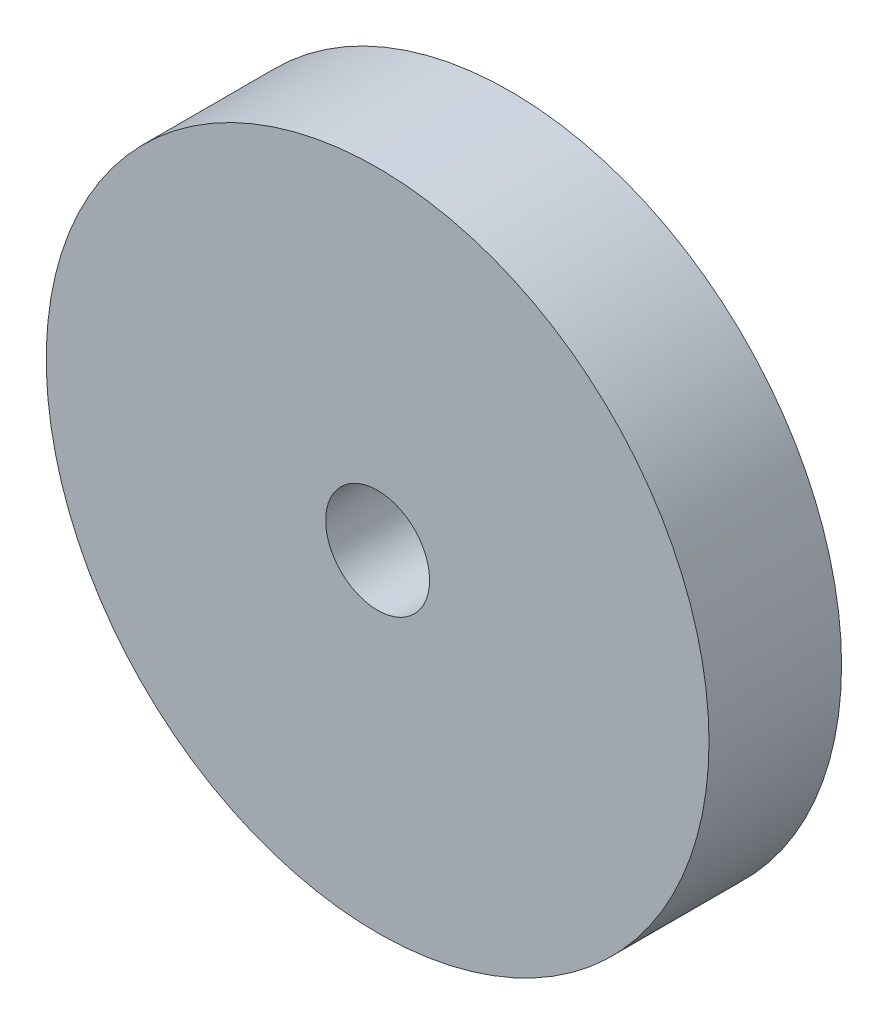
ISO-10303-21;
HEADER;
FILE_DESCRIPTION(('STEP AP214'),'2;1');
FILE_NAME('part.step','',(''),(''),'','','');
FILE_SCHEMA(('AUTOMOTIVE_DESIGN { 1 0 10303 214 1 1 1 1 }'));
ENDSEC;
DATA;
#1=APPLICATION_CONTEXT('core data for automotive mechanical design processes');
#2=APPLICATION_PROTOCOL_DEFINITION('international standard','automotive_design',2000,#1);
#3=PRODUCT_CONTEXT('',#1,'mechanical');
#4=PRODUCT('Part','Part','',(#3));
#5=PRODUCT_RELATED_PRODUCT_CATEGORY('part','',(#4));
#6=PRODUCT_DEFINITION_FORMATION('','',#4);
#7=PRODUCT_DEFINITION_CONTEXT('part definition',#1,'design');
#8=PRODUCT_DEFINITION('design','',#6,#7);
#9=PRODUCT_DEFINITION_SHAPE('','',#8);
#10=(LENGTH_UNIT() NAMED_UNIT(*) SI_UNIT(.MILLI.,.METRE.));
#11=(NAMED_UNIT(*) PLANE_ANGLE_UNIT() SI_UNIT($,.RADIAN.));
#12=(NAMED_UNIT(*) SI_UNIT($,.STERADIAN.) SOLID_ANGLE_UNIT());
#13=UNCERTAINTY_MEASURE_WITH_UNIT(LENGTH_MEASURE(1.E-05),#10,'distance_accuracy_value','');
#14=(GEOMETRIC_REPRESENTATION_CONTEXT(3) GLOBAL_UNCERTAINTY_ASSIGNED_CONTEXT((#13)) GLOBAL_UNIT_ASSIGNED_CONTEXT((#10,
#11,#12)) REPRESENTATION_CONTEXT('',''));
#15=CARTESIAN_POINT('',(0.,0.,0.));
#16=DIRECTION('',(0.,0.,1.));
#17=DIRECTION('',(1.,0.,0.));
#18=AXIS2_PLACEMENT_3D('',#15,#16,#17);
#19=CARTESIAN_POINT('',(0.,0.,6.35));
#20=DIRECTION('',(0.,0.,-1.));
#21=DIRECTION('',(-1.,0.,0.));
#22=AXIS2_PLACEMENT_3D('',#19,#20,#21);
#23=CYLINDRICAL_SURFACE('',#22,15.875);
#24=CARTESIAN_POINT('',(0.,0.,6.35));
#25=DIRECTION('',(0.,0.,1.));
#26=DIRECTION('',(1.,0.,0.));
#27=AXIS2_PLACEMENT_3D('',#24,#25,#26);
#28=CIRCLE('',#27,15.875);
#29=CARTESIAN_POINT('',(15.875,0.,6.35));
#30=VERTEX_POINT('',#29);
#31=EDGE_CURVE('E10',#30,#30,#28,.T.);
#32=ORIENTED_EDGE('',*,*,#31,.F.);
#33=EDGE_LOOP('',(#32));
#34=FACE_BOUND('',#33,.T.);
#35=CARTESIAN_POINT('',(0.,0.,0.));
#36=DIRECTION('',(0.,0.,1.));
#37=DIRECTION('',(1.,0.,0.));
#38=AXIS2_PLACEMENT_3D('',#35,#36,#37);
#39=CIRCLE('',#38,15.875);
#40=CARTESIAN_POINT('',(15.875,0.,0.));
#41=VERTEX_POINT('',#40);
#42=EDGE_CURVE('E44',#41,#41,#39,.T.);
#43=ORIENTED_EDGE('',*,*,#42,.T.);
#44=EDGE_LOOP('',(#43));
#45=FACE_BOUND('',#44,.T.);
#46=ADVANCED_FACE('F41',(#34,#45),#23,.T.);
#47=CARTESIAN_POINT('',(0.,0.,6.35));
#48=DIRECTION('',(0.,0.,1.));
#49=DIRECTION('',(1.,0.,0.));
#50=AXIS2_PLACEMENT_3D('',#47,#48,#49);
#51=PLANE('',#50);
#52=CARTESIAN_POINT('',(0.,0.,6.35));
#53=DIRECTION('',(0.,0.,1.));
#54=DIRECTION('',(1.,0.,0.));
#55=AXIS2_PLACEMENT_3D('',#52,#53,#54);
#56=CIRCLE('',#55,2.4892);
#57=CARTESIAN_POINT('',(2.4892,0.,6.35));
#58=VERTEX_POINT('',#57);
#59=EDGE_CURVE('E53',#58,#58,#56,.T.);
#60=ORIENTED_EDGE('',*,*,#59,.F.);
#61=EDGE_LOOP('',(#60));
#62=FACE_BOUND('',#61,.T.);
#63=ORIENTED_EDGE('',*,*,#31,.T.);
#64=EDGE_LOOP('',(#63));
#65=FACE_BOUND('',#64,.T.);
#66=ADVANCED_FACE('F68',(#62,#65),#51,.T.);
#67=CARTESIAN_POINT('',(0.,0.,0.));
#68=DIRECTION('',(0.,0.,1.));
#69=DIRECTION('',(1.,0.,0.));
#70=AXIS2_PLACEMENT_3D('',#67,#68,#69);
#71=PLANE('',#70);
#72=CARTESIAN_POINT('',(0.,0.,0.));
#73=DIRECTION('',(0.,0.,1.));
#74=DIRECTION('',(1.,0.,0.));
#75=AXIS2_PLACEMENT_3D('',#72,#73,#74);
#76=CIRCLE('',#75,2.4892);
#77=CARTESIAN_POINT('',(2.4892,0.,0.));
#78=VERTEX_POINT('',#77);
#79=EDGE_CURVE('E51',#78,#78,#76,.T.);
#80=ORIENTED_EDGE('',*,*,#79,.T.);
#81=EDGE_LOOP('',(#80));
#82=FACE_BOUND('',#81,.T.);
#83=ORIENTED_EDGE('',*,*,#42,.F.);
#84=EDGE_LOOP('',(#83));
#85=FACE_BOUND('',#84,.T.);
#86=ADVANCED_FACE('F59',(#82,#85),#71,.F.);
#87=CARTESIAN_POINT('',(0.,0.,0.));
#88=DIRECTION('',(0.,0.,1.));
#89=DIRECTION('',(1.,0.,0.));
#90=AXIS2_PLACEMENT_3D('',#87,#88,#89);
#91=CYLINDRICAL_SURFACE('',#90,2.4892);
#92=ORIENTED_EDGE('',*,*,#79,.F.);
#93=EDGE_LOOP('',(#92));
#94=FACE_BOUND('',#93,.T.);
#95=ORIENTED_EDGE('',*,*,#59,.T.);
#96=EDGE_LOOP('',(#95));
#97=FACE_BOUND('',#96,.T.);
#98=ADVANCED_FACE('F62',(#94,#97),#91,.F.);
#99=CLOSED_SHELL('',(#46,#66,#86,#98));
#100=MANIFOLD_SOLID_BREP('B2',#99);
#101=ADVANCED_BREP_SHAPE_REPRESENTATION('',(#18,#100),#14);
#102=SHAPE_DEFINITION_REPRESENTATION(#9,#101);
ENDSEC;
END-ISO-10303-21;
